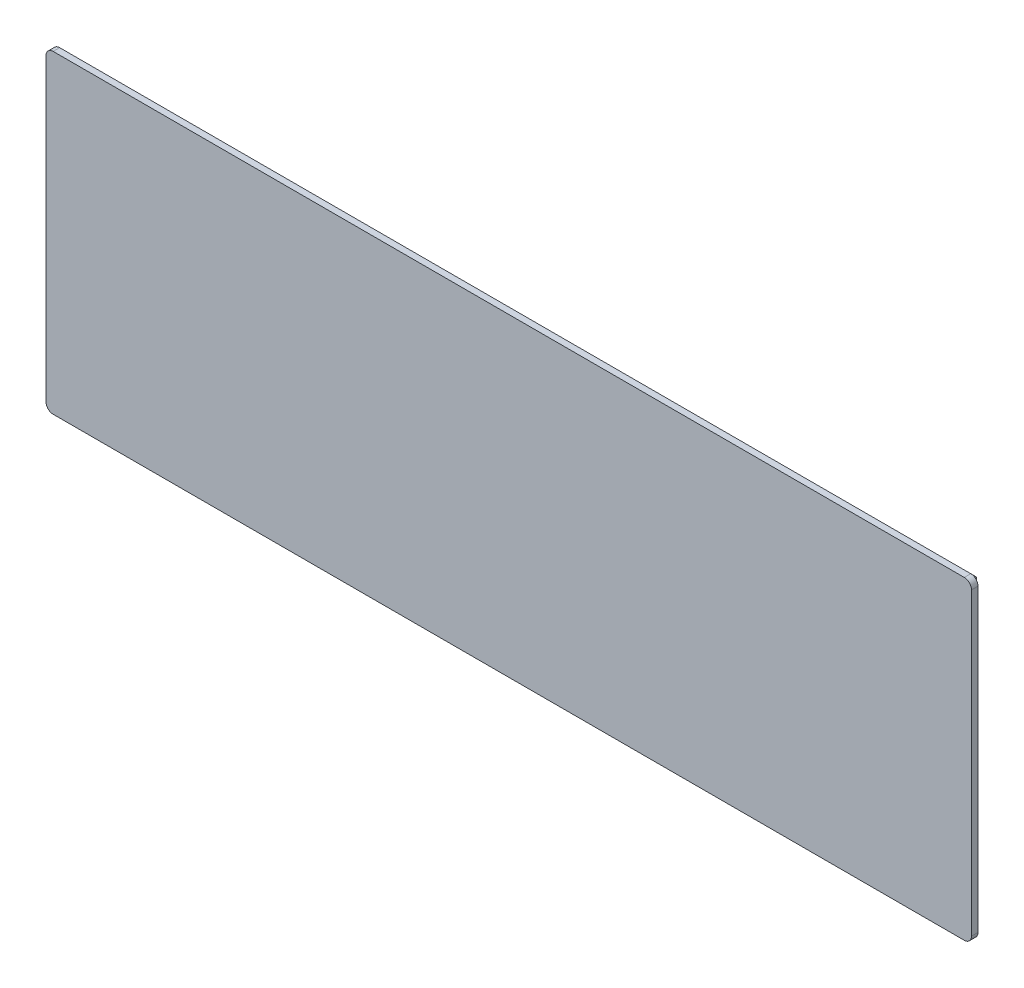
ISO-10303-21;
HEADER;
FILE_DESCRIPTION(('STEP AP214'),'2;1');
FILE_NAME('part.step','',(''),(''),'','','');
FILE_SCHEMA(('AUTOMOTIVE_DESIGN { 1 0 10303 214 1 1 1 1 }'));
ENDSEC;
DATA;
#1=APPLICATION_CONTEXT('core data for automotive mechanical design processes');
#2=APPLICATION_PROTOCOL_DEFINITION('international standard','automotive_design',2000,#1);
#3=PRODUCT_CONTEXT('',#1,'mechanical');
#4=PRODUCT('Part','Part','',(#3));
#5=PRODUCT_RELATED_PRODUCT_CATEGORY('part','',(#4));
#6=PRODUCT_DEFINITION_FORMATION('','',#4);
#7=PRODUCT_DEFINITION_CONTEXT('part definition',#1,'design');
#8=PRODUCT_DEFINITION('design','',#6,#7);
#9=PRODUCT_DEFINITION_SHAPE('','',#8);
#10=(LENGTH_UNIT() NAMED_UNIT(*) SI_UNIT(.MILLI.,.METRE.));
#11=(NAMED_UNIT(*) PLANE_ANGLE_UNIT() SI_UNIT($,.RADIAN.));
#12=(NAMED_UNIT(*) SI_UNIT($,.STERADIAN.) SOLID_ANGLE_UNIT());
#13=UNCERTAINTY_MEASURE_WITH_UNIT(LENGTH_MEASURE(1.E-05),#10,'distance_accuracy_value','');
#14=(GEOMETRIC_REPRESENTATION_CONTEXT(3) GLOBAL_UNCERTAINTY_ASSIGNED_CONTEXT((#13)) GLOBAL_UNIT_ASSIGNED_CONTEXT((#10,
#11,#12)) REPRESENTATION_CONTEXT('',''));
#15=CARTESIAN_POINT('',(0.,0.,0.));
#16=DIRECTION('',(0.,0.,1.));
#17=DIRECTION('',(1.,0.,0.));
#18=AXIS2_PLACEMENT_3D('',#15,#16,#17);
#19=CARTESIAN_POINT('',(158.,-52.,0.));
#20=DIRECTION('',(0.,0.,1.));
#21=DIRECTION('',(1.,0.,0.));
#22=AXIS2_PLACEMENT_3D('',#19,#20,#21);
#23=PLANE('',#22);
#24=DIRECTION('',(0.,-1.,0.));
#25=VECTOR('',#24,1.);
#26=CARTESIAN_POINT('',(35.,-52.,0.));
#27=LINE('',#26,#25);
#28=CARTESIAN_POINT('',(35.,-52.,0.));
#29=VERTEX_POINT('',#28);
#30=CARTESIAN_POINT('',(35.,-54.5,0.));
#31=VERTEX_POINT('',#30);
#32=EDGE_CURVE('E167',#29,#31,#27,.T.);
#33=ORIENTED_EDGE('',*,*,#32,.F.);
#34=DIRECTION('',(-1.,0.,0.));
#35=VECTOR('',#34,1.);
#36=CARTESIAN_POINT('',(157.5,-52.,0.));
#37=LINE('',#36,#35);
#38=CARTESIAN_POINT('',(157.5,-52.,0.));
#39=VERTEX_POINT('',#38);
#40=EDGE_CURVE('E206',#39,#29,#37,.T.);
#41=ORIENTED_EDGE('',*,*,#40,.F.);
#42=DIRECTION('',(0.,-1.,0.));
#43=VECTOR('',#42,1.);
#44=CARTESIAN_POINT('',(157.5,52.,0.));
#45=LINE('',#44,#43);
#46=CARTESIAN_POINT('',(157.5,52.,0.));
#47=VERTEX_POINT('',#46);
#48=EDGE_CURVE('E63',#47,#39,#45,.T.);
#49=ORIENTED_EDGE('',*,*,#48,.F.);
#50=DIRECTION('',(1.,0.,0.));
#51=VECTOR('',#50,1.);
#52=CARTESIAN_POINT('',(157.5,52.,0.));
#53=LINE('',#52,#51);
#54=CARTESIAN_POINT('',(-157.5,52.,0.));
#55=VERTEX_POINT('',#54);
#56=EDGE_CURVE('E193',#55,#47,#53,.T.);
#57=ORIENTED_EDGE('',*,*,#56,.F.);
#58=DIRECTION('',(0.,1.,0.));
#59=VECTOR('',#58,1.);
#60=CARTESIAN_POINT('',(-157.5,52.,0.));
#61=LINE('',#60,#59);
#62=CARTESIAN_POINT('',(-157.5,-52.,0.));
#63=VERTEX_POINT('',#62);
#64=EDGE_CURVE('E210',#63,#55,#61,.T.);
#65=ORIENTED_EDGE('',*,*,#64,.F.);
#66=CARTESIAN_POINT('',(-35.,-52.,0.));
#67=VERTEX_POINT('',#66);
#68=EDGE_CURVE('E205',#67,#63,#37,.T.);
#69=ORIENTED_EDGE('',*,*,#68,.F.);
#70=DIRECTION('',(0.,1.,0.));
#71=VECTOR('',#70,1.);
#72=CARTESIAN_POINT('',(-35.,-52.,0.));
#73=LINE('',#72,#71);
#74=CARTESIAN_POINT('',(-35.,-54.5,0.));
#75=VERTEX_POINT('',#74);
#76=EDGE_CURVE('E180',#75,#67,#73,.T.);
#77=ORIENTED_EDGE('',*,*,#76,.F.);
#78=DIRECTION('',(1.,0.,0.));
#79=VECTOR('',#78,1.);
#80=CARTESIAN_POINT('',(-158.,-54.5,0.));
#81=LINE('',#80,#79);
#82=CARTESIAN_POINT('',(-158.,-54.5,0.));
#83=VERTEX_POINT('',#82);
#84=EDGE_CURVE('E237',#83,#75,#81,.T.);
#85=ORIENTED_EDGE('',*,*,#84,.F.);
#86=CARTESIAN_POINT('',(-158.,-52.,0.));
#87=DIRECTION('',(0.,0.,1.));
#88=DIRECTION('',(-1.,0.,0.));
#89=AXIS2_PLACEMENT_3D('',#86,#87,#88);
#90=CIRCLE('',#89,2.5);
#91=CARTESIAN_POINT('',(-160.5,-52.,0.));
#92=VERTEX_POINT('',#91);
#93=EDGE_CURVE('E277',#92,#83,#90,.T.);
#94=ORIENTED_EDGE('',*,*,#93,.F.);
#95=DIRECTION('',(0.,-1.,0.));
#96=VECTOR('',#95,1.);
#97=CARTESIAN_POINT('',(-160.5,-52.,0.));
#98=LINE('',#97,#96);
#99=CARTESIAN_POINT('',(-160.5,52.,0.));
#100=VERTEX_POINT('',#99);
#101=EDGE_CURVE('E274',#100,#92,#98,.T.);
#102=ORIENTED_EDGE('',*,*,#101,.F.);
#103=CARTESIAN_POINT('',(-158.,52.,0.));
#104=DIRECTION('',(0.,0.,1.));
#105=DIRECTION('',(-1.,0.,0.));
#106=AXIS2_PLACEMENT_3D('',#103,#104,#105);
#107=CIRCLE('',#106,2.5);
#108=CARTESIAN_POINT('',(-158.,54.5,0.));
#109=VERTEX_POINT('',#108);
#110=EDGE_CURVE('E271',#109,#100,#107,.T.);
#111=ORIENTED_EDGE('',*,*,#110,.F.);
#112=DIRECTION('',(-1.,0.,0.));
#113=VECTOR('',#112,1.);
#114=CARTESIAN_POINT('',(-158.,54.5,0.));
#115=LINE('',#114,#113);
#116=CARTESIAN_POINT('',(158.,54.5,0.));
#117=VERTEX_POINT('',#116);
#118=EDGE_CURVE('E268',#117,#109,#115,.T.);
#119=ORIENTED_EDGE('',*,*,#118,.F.);
#120=CARTESIAN_POINT('',(158.,52.,0.));
#121=DIRECTION('',(0.,0.,1.));
#122=DIRECTION('',(-1.,0.,0.));
#123=AXIS2_PLACEMENT_3D('',#120,#121,#122);
#124=CIRCLE('',#123,2.5);
#125=CARTESIAN_POINT('',(160.5,52.,0.));
#126=VERTEX_POINT('',#125);
#127=EDGE_CURVE('E265',#126,#117,#124,.T.);
#128=ORIENTED_EDGE('',*,*,#127,.F.);
#129=DIRECTION('',(0.,1.,0.));
#130=VECTOR('',#129,1.);
#131=CARTESIAN_POINT('',(160.5,-52.,0.));
#132=LINE('',#131,#130);
#133=CARTESIAN_POINT('',(160.5,-52.,0.));
#134=VERTEX_POINT('',#133);
#135=EDGE_CURVE('E262',#134,#126,#132,.T.);
#136=ORIENTED_EDGE('',*,*,#135,.F.);
#137=CARTESIAN_POINT('',(158.,-52.,0.));
#138=DIRECTION('',(0.,0.,1.));
#139=DIRECTION('',(1.,0.,0.));
#140=AXIS2_PLACEMENT_3D('',#137,#138,#139);
#141=CIRCLE('',#140,2.5);
#142=CARTESIAN_POINT('',(158.,-54.5,0.));
#143=VERTEX_POINT('',#142);
#144=EDGE_CURVE('E231',#143,#134,#141,.T.);
#145=ORIENTED_EDGE('',*,*,#144,.F.);
#146=EDGE_CURVE('E280',#31,#143,#81,.T.);
#147=ORIENTED_EDGE('',*,*,#146,.F.);
#148=EDGE_LOOP('',(#33,#41,#49,#57,#65,#69,#77,#85,#94,#102,#111,#119,#128,#136,#145,#147));
#149=FACE_BOUND('',#148,.T.);
#150=ADVANCED_FACE('F39',(#149),#23,.F.);
#151=CARTESIAN_POINT('',(157.5,-52.,-2.5));
#152=DIRECTION('',(0.,1.,0.));
#153=DIRECTION('',(0.,0.,1.));
#154=AXIS2_PLACEMENT_3D('',#151,#152,#153);
#155=PLANE('',#154);
#156=DIRECTION('',(0.,0.,1.));
#157=VECTOR('',#156,1.);
#158=CARTESIAN_POINT('',(35.,-52.,-72.5446286306095));
#159=LINE('',#158,#157);
#160=CARTESIAN_POINT('',(35.,-52.,-2.5));
#161=VERTEX_POINT('',#160);
#162=EDGE_CURVE('E186',#161,#29,#159,.T.);
#163=ORIENTED_EDGE('',*,*,#162,.F.);
#164=DIRECTION('',(-1.,0.,0.));
#165=VECTOR('',#164,1.);
#166=CARTESIAN_POINT('',(157.5,-52.,-2.5));
#167=LINE('',#166,#165);
#168=CARTESIAN_POINT('',(157.5,-52.,-2.5));
#169=VERTEX_POINT('',#168);
#170=EDGE_CURVE('E174',#169,#161,#167,.T.);
#171=ORIENTED_EDGE('',*,*,#170,.F.);
#172=DIRECTION('',(0.,0.,1.));
#173=VECTOR('',#172,1.);
#174=CARTESIAN_POINT('',(157.5,-52.,-2.5));
#175=LINE('',#174,#173);
#176=EDGE_CURVE('E227',#169,#39,#175,.T.);
#177=ORIENTED_EDGE('',*,*,#176,.T.);
#178=ORIENTED_EDGE('',*,*,#40,.T.);
#179=EDGE_LOOP('',(#163,#171,#177,#178));
#180=FACE_BOUND('',#179,.T.);
#181=ADVANCED_FACE('F366',(#180),#155,.F.);
#182=DIRECTION('',(0.,0.,1.));
#183=VECTOR('',#182,1.);
#184=CARTESIAN_POINT('',(-35.,-52.,-72.5446286306095));
#185=LINE('',#184,#183);
#186=CARTESIAN_POINT('',(-35.,-52.,-2.5));
#187=VERTEX_POINT('',#186);
#188=EDGE_CURVE('E176',#187,#67,#185,.T.);
#189=ORIENTED_EDGE('',*,*,#188,.T.);
#190=ORIENTED_EDGE('',*,*,#68,.T.);
#191=DIRECTION('',(0.,0.,1.));
#192=VECTOR('',#191,1.);
#193=CARTESIAN_POINT('',(-157.5,-52.,-2.5));
#194=LINE('',#193,#192);
#195=CARTESIAN_POINT('',(-157.5,-52.,-2.5));
#196=VERTEX_POINT('',#195);
#197=EDGE_CURVE('E223',#196,#63,#194,.T.);
#198=ORIENTED_EDGE('',*,*,#197,.F.);
#199=EDGE_CURVE('E192',#187,#196,#167,.T.);
#200=ORIENTED_EDGE('',*,*,#199,.F.);
#201=EDGE_LOOP('',(#189,#190,#198,#200));
#202=FACE_BOUND('',#201,.T.);
#203=ADVANCED_FACE('F350',(#202),#155,.F.);
#204=CARTESIAN_POINT('',(158.,-52.,2.25));
#205=DIRECTION('',(0.,0.,-1.));
#206=DIRECTION('',(-1.,0.,0.));
#207=AXIS2_PLACEMENT_3D('',#204,#205,#206);
#208=CYLINDRICAL_SURFACE('',#207,2.5);
#209=ORIENTED_EDGE('',*,*,#144,.T.);
#210=DIRECTION('',(0.,0.,-1.));
#211=VECTOR('',#210,1.);
#212=CARTESIAN_POINT('',(160.5,-52.,2.25));
#213=LINE('',#212,#211);
#214=CARTESIAN_POINT('',(160.5,-52.,2.25));
#215=VERTEX_POINT('',#214);
#216=EDGE_CURVE('E11',#215,#134,#213,.T.);
#217=ORIENTED_EDGE('',*,*,#216,.F.);
#218=CARTESIAN_POINT('',(158.,-52.,2.25));
#219=DIRECTION('',(0.,0.,1.));
#220=DIRECTION('',(1.,0.,0.));
#221=AXIS2_PLACEMENT_3D('',#218,#219,#220);
#222=CIRCLE('',#221,2.5);
#223=CARTESIAN_POINT('',(158.,-54.5,2.25));
#224=VERTEX_POINT('',#223);
#225=EDGE_CURVE('E232',#224,#215,#222,.T.);
#226=ORIENTED_EDGE('',*,*,#225,.F.);
#227=DIRECTION('',(0.,0.,-1.));
#228=VECTOR('',#227,1.);
#229=CARTESIAN_POINT('',(158.,-54.5,2.25));
#230=LINE('',#229,#228);
#231=EDGE_CURVE('E258',#224,#143,#230,.T.);
#232=ORIENTED_EDGE('',*,*,#231,.T.);
#233=EDGE_LOOP('',(#209,#217,#226,#232));
#234=FACE_BOUND('',#233,.T.);
#235=ADVANCED_FACE('F41',(#234),#208,.T.);
#236=CARTESIAN_POINT('',(160.5,-52.,2.25));
#237=DIRECTION('',(-1.,0.,0.));
#238=DIRECTION('',(0.,0.,1.));
#239=AXIS2_PLACEMENT_3D('',#236,#237,#238);
#240=PLANE('',#239);
#241=ORIENTED_EDGE('',*,*,#135,.T.);
#242=DIRECTION('',(0.,0.,-1.));
#243=VECTOR('',#242,1.);
#244=CARTESIAN_POINT('',(160.5,52.,2.25));
#245=LINE('',#244,#243);
#246=CARTESIAN_POINT('',(160.5,52.,2.25));
#247=VERTEX_POINT('',#246);
#248=EDGE_CURVE('E48',#247,#126,#245,.T.);
#249=ORIENTED_EDGE('',*,*,#248,.F.);
#250=DIRECTION('',(0.,1.,0.));
#251=VECTOR('',#250,1.);
#252=CARTESIAN_POINT('',(160.5,-52.,2.25));
#253=LINE('',#252,#251);
#254=EDGE_CURVE('E236',#215,#247,#253,.T.);
#255=ORIENTED_EDGE('',*,*,#254,.F.);
#256=ORIENTED_EDGE('',*,*,#216,.T.);
#257=EDGE_LOOP('',(#241,#249,#255,#256));
#258=FACE_BOUND('',#257,.T.);
#259=ADVANCED_FACE('F332',(#258),#240,.F.);
#260=CARTESIAN_POINT('',(158.,52.,2.25));
#261=DIRECTION('',(0.,0.,-1.));
#262=DIRECTION('',(-1.,0.,0.));
#263=AXIS2_PLACEMENT_3D('',#260,#261,#262);
#264=CYLINDRICAL_SURFACE('',#263,2.5);
#265=ORIENTED_EDGE('',*,*,#127,.T.);
#266=DIRECTION('',(0.,0.,-1.));
#267=VECTOR('',#266,1.);
#268=CARTESIAN_POINT('',(158.,54.5,2.25));
#269=LINE('',#268,#267);
#270=CARTESIAN_POINT('',(158.,54.5,2.25));
#271=VERTEX_POINT('',#270);
#272=EDGE_CURVE('E302',#271,#117,#269,.T.);
#273=ORIENTED_EDGE('',*,*,#272,.F.);
#274=CARTESIAN_POINT('',(158.,52.,2.25));
#275=DIRECTION('',(0.,0.,1.));
#276=DIRECTION('',(-1.,0.,0.));
#277=AXIS2_PLACEMENT_3D('',#274,#275,#276);
#278=CIRCLE('',#277,2.5);
#279=EDGE_CURVE('E240',#247,#271,#278,.T.);
#280=ORIENTED_EDGE('',*,*,#279,.F.);
#281=ORIENTED_EDGE('',*,*,#248,.T.);
#282=EDGE_LOOP('',(#265,#273,#280,#281));
#283=FACE_BOUND('',#282,.T.);
#284=ADVANCED_FACE('F311',(#283),#264,.T.);
#285=CARTESIAN_POINT('',(-158.,54.5,2.25));
#286=DIRECTION('',(0.,-1.,0.));
#287=DIRECTION('',(0.,0.,-1.));
#288=AXIS2_PLACEMENT_3D('',#285,#286,#287);
#289=PLANE('',#288);
#290=ORIENTED_EDGE('',*,*,#118,.T.);
#291=DIRECTION('',(0.,0.,-1.));
#292=VECTOR('',#291,1.);
#293=CARTESIAN_POINT('',(-158.,54.5,2.25));
#294=LINE('',#293,#292);
#295=CARTESIAN_POINT('',(-158.,54.5,2.25));
#296=VERTEX_POINT('',#295);
#297=EDGE_CURVE('E298',#296,#109,#294,.T.);
#298=ORIENTED_EDGE('',*,*,#297,.F.);
#299=DIRECTION('',(-1.,0.,0.));
#300=VECTOR('',#299,1.);
#301=CARTESIAN_POINT('',(-158.,54.5,2.25));
#302=LINE('',#301,#300);
#303=EDGE_CURVE('E243',#271,#296,#302,.T.);
#304=ORIENTED_EDGE('',*,*,#303,.F.);
#305=ORIENTED_EDGE('',*,*,#272,.T.);
#306=EDGE_LOOP('',(#290,#298,#304,#305));
#307=FACE_BOUND('',#306,.T.);
#308=ADVANCED_FACE('F320',(#307),#289,.F.);
#309=CARTESIAN_POINT('',(-158.,52.,2.25));
#310=DIRECTION('',(0.,0.,-1.));
#311=DIRECTION('',(-1.,0.,0.));
#312=AXIS2_PLACEMENT_3D('',#309,#310,#311);
#313=CYLINDRICAL_SURFACE('',#312,2.5);
#314=ORIENTED_EDGE('',*,*,#110,.T.);
#315=DIRECTION('',(0.,0.,-1.));
#316=VECTOR('',#315,1.);
#317=CARTESIAN_POINT('',(-160.5,52.,2.25));
#318=LINE('',#317,#316);
#319=CARTESIAN_POINT('',(-160.5,52.,2.25));
#320=VERTEX_POINT('',#319);
#321=EDGE_CURVE('E294',#320,#100,#318,.T.);
#322=ORIENTED_EDGE('',*,*,#321,.F.);
#323=CARTESIAN_POINT('',(-158.,52.,2.25));
#324=DIRECTION('',(0.,0.,1.));
#325=DIRECTION('',(-1.,0.,0.));
#326=AXIS2_PLACEMENT_3D('',#323,#324,#325);
#327=CIRCLE('',#326,2.5);
#328=EDGE_CURVE('E246',#296,#320,#327,.T.);
#329=ORIENTED_EDGE('',*,*,#328,.F.);
#330=ORIENTED_EDGE('',*,*,#297,.T.);
#331=EDGE_LOOP('',(#314,#322,#329,#330));
#332=FACE_BOUND('',#331,.T.);
#333=ADVANCED_FACE('F324',(#332),#313,.T.);
#334=CARTESIAN_POINT('',(-160.5,-52.,2.25));
#335=DIRECTION('',(1.,0.,0.));
#336=DIRECTION('',(0.,0.,-1.));
#337=AXIS2_PLACEMENT_3D('',#334,#335,#336);
#338=PLANE('',#337);
#339=ORIENTED_EDGE('',*,*,#101,.T.);
#340=DIRECTION('',(0.,0.,-1.));
#341=VECTOR('',#340,1.);
#342=CARTESIAN_POINT('',(-160.5,-52.,2.25));
#343=LINE('',#342,#341);
#344=CARTESIAN_POINT('',(-160.5,-52.,2.25));
#345=VERTEX_POINT('',#344);
#346=EDGE_CURVE('E290',#345,#92,#343,.T.);
#347=ORIENTED_EDGE('',*,*,#346,.F.);
#348=DIRECTION('',(0.,-1.,0.));
#349=VECTOR('',#348,1.);
#350=CARTESIAN_POINT('',(-160.5,-52.,2.25));
#351=LINE('',#350,#349);
#352=EDGE_CURVE('E249',#320,#345,#351,.T.);
#353=ORIENTED_EDGE('',*,*,#352,.F.);
#354=ORIENTED_EDGE('',*,*,#321,.T.);
#355=EDGE_LOOP('',(#339,#347,#353,#354));
#356=FACE_BOUND('',#355,.T.);
#357=ADVANCED_FACE('F386',(#356),#338,.F.);
#358=CARTESIAN_POINT('',(-158.,-52.,2.25));
#359=DIRECTION('',(0.,0.,-1.));
#360=DIRECTION('',(-1.,0.,0.));
#361=AXIS2_PLACEMENT_3D('',#358,#359,#360);
#362=CYLINDRICAL_SURFACE('',#361,2.5);
#363=ORIENTED_EDGE('',*,*,#93,.T.);
#364=DIRECTION('',(0.,0.,-1.));
#365=VECTOR('',#364,1.);
#366=CARTESIAN_POINT('',(-158.,-54.5,2.25));
#367=LINE('',#366,#365);
#368=CARTESIAN_POINT('',(-158.,-54.5,2.25));
#369=VERTEX_POINT('',#368);
#370=EDGE_CURVE('E286',#369,#83,#367,.T.);
#371=ORIENTED_EDGE('',*,*,#370,.F.);
#372=CARTESIAN_POINT('',(-158.,-52.,2.25));
#373=DIRECTION('',(0.,0.,1.));
#374=DIRECTION('',(-1.,0.,0.));
#375=AXIS2_PLACEMENT_3D('',#372,#373,#374);
#376=CIRCLE('',#375,2.5);
#377=EDGE_CURVE('E252',#345,#369,#376,.T.);
#378=ORIENTED_EDGE('',*,*,#377,.F.);
#379=ORIENTED_EDGE('',*,*,#346,.T.);
#380=EDGE_LOOP('',(#363,#371,#378,#379));
#381=FACE_BOUND('',#380,.T.);
#382=ADVANCED_FACE('F383',(#381),#362,.T.);
#383=CARTESIAN_POINT('',(-158.,-54.5,2.25));
#384=DIRECTION('',(0.,1.,0.));
#385=DIRECTION('',(0.,0.,1.));
#386=AXIS2_PLACEMENT_3D('',#383,#384,#385);
#387=PLANE('',#386);
#388=ORIENTED_EDGE('',*,*,#84,.T.);
#389=DIRECTION('',(0.,0.,1.));
#390=VECTOR('',#389,1.);
#391=CARTESIAN_POINT('',(-35.,-54.5,-72.5446286306095));
#392=LINE('',#391,#390);
#393=CARTESIAN_POINT('',(-35.,-54.5,-2.5));
#394=VERTEX_POINT('',#393);
#395=EDGE_CURVE('E158',#394,#75,#392,.T.);
#396=ORIENTED_EDGE('',*,*,#395,.F.);
#397=DIRECTION('',(-1.,0.,0.));
#398=VECTOR('',#397,1.);
#399=CARTESIAN_POINT('',(35.,-54.5,-2.5));
#400=LINE('',#399,#398);
#401=CARTESIAN_POINT('',(35.,-54.5,-2.5));
#402=VERTEX_POINT('',#401);
#403=EDGE_CURVE('E152',#402,#394,#400,.T.);
#404=ORIENTED_EDGE('',*,*,#403,.F.);
#405=DIRECTION('',(0.,0.,1.));
#406=VECTOR('',#405,1.);
#407=CARTESIAN_POINT('',(35.,-54.5,-72.5446286306095));
#408=LINE('',#407,#406);
#409=EDGE_CURVE('E156',#402,#31,#408,.T.);
#410=ORIENTED_EDGE('',*,*,#409,.T.);
#411=ORIENTED_EDGE('',*,*,#146,.T.);
#412=ORIENTED_EDGE('',*,*,#231,.F.);
#413=DIRECTION('',(1.,0.,0.));
#414=VECTOR('',#413,1.);
#415=CARTESIAN_POINT('',(-158.,-54.5,2.25));
#416=LINE('',#415,#414);
#417=EDGE_CURVE('E255',#369,#224,#416,.T.);
#418=ORIENTED_EDGE('',*,*,#417,.F.);
#419=ORIENTED_EDGE('',*,*,#370,.T.);
#420=EDGE_LOOP('',(#388,#396,#404,#410,#411,#412,#418,#419));
#421=FACE_BOUND('',#420,.T.);
#422=ADVANCED_FACE('F155',(#421),#387,.F.);
#423=CARTESIAN_POINT('',(158.,-52.,2.25));
#424=DIRECTION('',(0.,0.,1.));
#425=DIRECTION('',(1.,0.,0.));
#426=AXIS2_PLACEMENT_3D('',#423,#424,#425);
#427=PLANE('',#426);
#428=ORIENTED_EDGE('',*,*,#225,.T.);
#429=ORIENTED_EDGE('',*,*,#254,.T.);
#430=ORIENTED_EDGE('',*,*,#279,.T.);
#431=ORIENTED_EDGE('',*,*,#303,.T.);
#432=ORIENTED_EDGE('',*,*,#328,.T.);
#433=ORIENTED_EDGE('',*,*,#352,.T.);
#434=ORIENTED_EDGE('',*,*,#377,.T.);
#435=ORIENTED_EDGE('',*,*,#417,.T.);
#436=EDGE_LOOP('',(#428,#429,#430,#431,#432,#433,#434,#435));
#437=FACE_BOUND('',#436,.T.);
#438=ADVANCED_FACE('F328',(#437),#427,.T.);
#439=CARTESIAN_POINT('',(157.5,52.,-2.5));
#440=DIRECTION('',(-1.,0.,0.));
#441=DIRECTION('',(0.,-1.,0.));
#442=AXIS2_PLACEMENT_3D('',#439,#440,#441);
#443=PLANE('',#442);
#444=ORIENTED_EDGE('',*,*,#48,.T.);
#445=ORIENTED_EDGE('',*,*,#176,.F.);
#446=DIRECTION('',(0.,-1.,0.));
#447=VECTOR('',#446,1.);
#448=CARTESIAN_POINT('',(157.5,52.,-2.5));
#449=LINE('',#448,#447);
#450=CARTESIAN_POINT('',(157.5,52.,-2.5));
#451=VERTEX_POINT('',#450);
#452=EDGE_CURVE('E189',#451,#169,#449,.T.);
#453=ORIENTED_EDGE('',*,*,#452,.F.);
#454=DIRECTION('',(0.,0.,1.));
#455=VECTOR('',#454,1.);
#456=CARTESIAN_POINT('',(157.5,52.,-2.5));
#457=LINE('',#456,#455);
#458=EDGE_CURVE('E202',#451,#47,#457,.T.);
#459=ORIENTED_EDGE('',*,*,#458,.T.);
#460=EDGE_LOOP('',(#444,#445,#453,#459));
#461=FACE_BOUND('',#460,.T.);
#462=ADVANCED_FACE('F364',(#461),#443,.F.);
#463=CARTESIAN_POINT('',(-157.5,52.,-2.5));
#464=DIRECTION('',(1.,0.,0.));
#465=DIRECTION('',(0.,1.,0.));
#466=AXIS2_PLACEMENT_3D('',#463,#464,#465);
#467=PLANE('',#466);
#468=ORIENTED_EDGE('',*,*,#64,.T.);
#469=DIRECTION('',(0.,0.,1.));
#470=VECTOR('',#469,1.);
#471=CARTESIAN_POINT('',(-157.5,52.,-2.5));
#472=LINE('',#471,#470);
#473=CARTESIAN_POINT('',(-157.5,52.,-2.5));
#474=VERTEX_POINT('',#473);
#475=EDGE_CURVE('E219',#474,#55,#472,.T.);
#476=ORIENTED_EDGE('',*,*,#475,.F.);
#477=DIRECTION('',(0.,1.,0.));
#478=VECTOR('',#477,1.);
#479=CARTESIAN_POINT('',(-157.5,52.,-2.5));
#480=LINE('',#479,#478);
#481=EDGE_CURVE('E196',#196,#474,#480,.T.);
#482=ORIENTED_EDGE('',*,*,#481,.F.);
#483=ORIENTED_EDGE('',*,*,#197,.T.);
#484=EDGE_LOOP('',(#468,#476,#482,#483));
#485=FACE_BOUND('',#484,.T.);
#486=ADVANCED_FACE('F356',(#485),#467,.F.);
#487=CARTESIAN_POINT('',(157.5,52.,-2.5));
#488=DIRECTION('',(0.,-1.,0.));
#489=DIRECTION('',(0.,0.,-1.));
#490=AXIS2_PLACEMENT_3D('',#487,#488,#489);
#491=PLANE('',#490);
#492=ORIENTED_EDGE('',*,*,#56,.T.);
#493=ORIENTED_EDGE('',*,*,#458,.F.);
#494=DIRECTION('',(1.,0.,0.));
#495=VECTOR('',#494,1.);
#496=CARTESIAN_POINT('',(157.5,52.,-2.5));
#497=LINE('',#496,#495);
#498=EDGE_CURVE('E199',#474,#451,#497,.T.);
#499=ORIENTED_EDGE('',*,*,#498,.F.);
#500=ORIENTED_EDGE('',*,*,#475,.T.);
#501=EDGE_LOOP('',(#492,#493,#499,#500));
#502=FACE_BOUND('',#501,.T.);
#503=ADVANCED_FACE('F362',(#502),#491,.F.);
#504=CARTESIAN_POINT('',(0.,0.,-2.5));
#505=DIRECTION('',(0.,0.,-1.));
#506=DIRECTION('',(-1.,0.,0.));
#507=AXIS2_PLACEMENT_3D('',#504,#505,#506);
#508=PLANE('',#507);
#509=ORIENTED_EDGE('',*,*,#452,.T.);
#510=ORIENTED_EDGE('',*,*,#170,.T.);
#511=DIRECTION('',(0.,-1.,0.));
#512=VECTOR('',#511,1.);
#513=CARTESIAN_POINT('',(35.,-52.,-2.5));
#514=LINE('',#513,#512);
#515=EDGE_CURVE('E161',#161,#402,#514,.T.);
#516=ORIENTED_EDGE('',*,*,#515,.T.);
#517=ORIENTED_EDGE('',*,*,#403,.T.);
#518=DIRECTION('',(0.,1.,0.));
#519=VECTOR('',#518,1.);
#520=CARTESIAN_POINT('',(-35.,-52.,-2.5));
#521=LINE('',#520,#519);
#522=EDGE_CURVE('E55',#394,#187,#521,.T.);
#523=ORIENTED_EDGE('',*,*,#522,.T.);
#524=ORIENTED_EDGE('',*,*,#199,.T.);
#525=ORIENTED_EDGE('',*,*,#481,.T.);
#526=ORIENTED_EDGE('',*,*,#498,.T.);
#527=EDGE_LOOP('',(#509,#510,#516,#517,#523,#524,#525,#526));
#528=FACE_BOUND('',#527,.T.);
#529=ADVANCED_FACE('F173',(#528),#508,.T.);
#530=CARTESIAN_POINT('',(35.,-52.,-72.5446286306095));
#531=DIRECTION('',(-1.,0.,0.));
#532=DIRECTION('',(0.,0.,1.));
#533=AXIS2_PLACEMENT_3D('',#530,#531,#532);
#534=PLANE('',#533);
#535=ORIENTED_EDGE('',*,*,#515,.F.);
#536=ORIENTED_EDGE('',*,*,#162,.T.);
#537=ORIENTED_EDGE('',*,*,#32,.T.);
#538=ORIENTED_EDGE('',*,*,#409,.F.);
#539=EDGE_LOOP('',(#535,#536,#537,#538));
#540=FACE_BOUND('',#539,.T.);
#541=ADVANCED_FACE('F164',(#540),#534,.F.);
#542=CARTESIAN_POINT('',(-35.,-52.,-72.5446286306095));
#543=DIRECTION('',(1.,0.,0.));
#544=DIRECTION('',(0.,0.,-1.));
#545=AXIS2_PLACEMENT_3D('',#542,#543,#544);
#546=PLANE('',#545);
#547=ORIENTED_EDGE('',*,*,#522,.F.);
#548=ORIENTED_EDGE('',*,*,#395,.T.);
#549=ORIENTED_EDGE('',*,*,#76,.T.);
#550=ORIENTED_EDGE('',*,*,#188,.F.);
#551=EDGE_LOOP('',(#547,#548,#549,#550));
#552=FACE_BOUND('',#551,.T.);
#553=ADVANCED_FACE('F345',(#552),#546,.F.);
#554=CLOSED_SHELL('',(#150,#181,#203,#235,#259,#284,#308,#333,#357,#382,#422,#438,#462,#486,
#503,#529,#541,#553));
#555=MANIFOLD_SOLID_BREP('B2',#554);
#556=ADVANCED_BREP_SHAPE_REPRESENTATION('',(#18,#555),#14);
#557=SHAPE_DEFINITION_REPRESENTATION(#9,#556);
ENDSEC;
END-ISO-10303-21;
